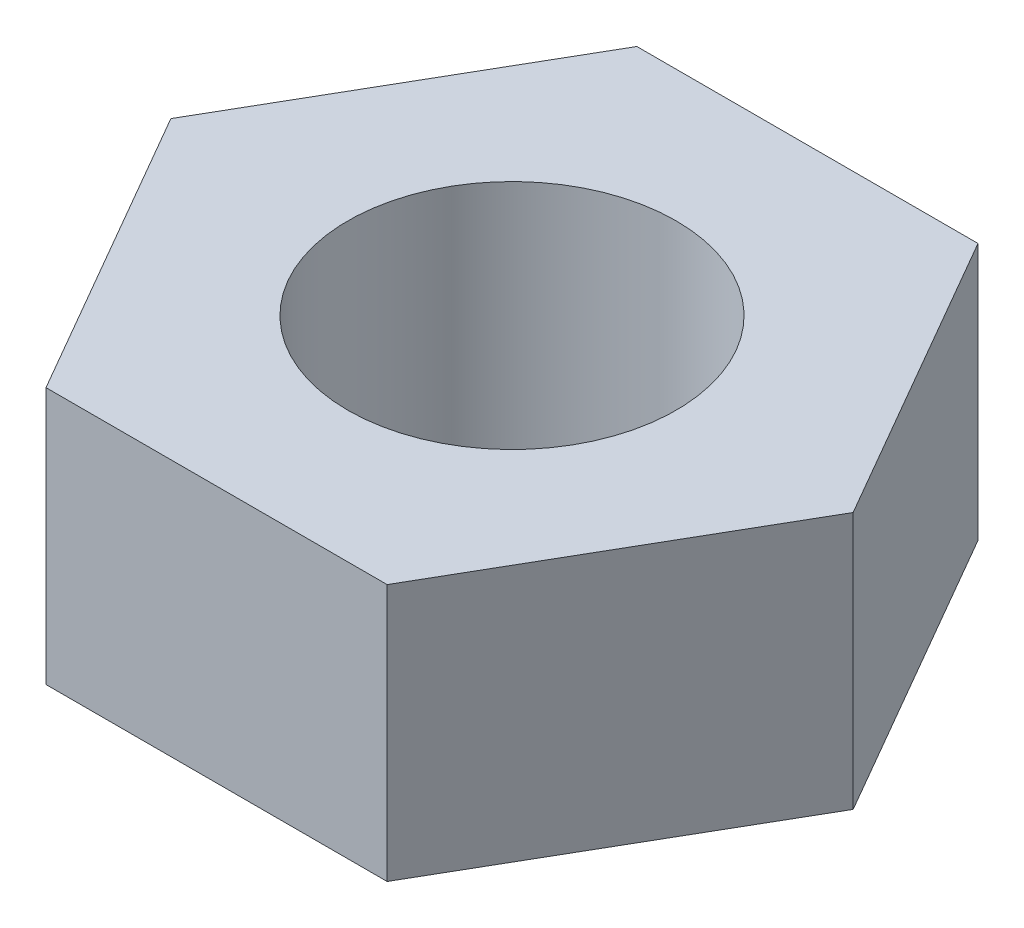
ISO-10303-21;
HEADER;
FILE_DESCRIPTION(('STEP AP214'),'2;1');
FILE_NAME('part.step','',(''),(''),'','','');
FILE_SCHEMA(('AUTOMOTIVE_DESIGN { 1 0 10303 214 1 1 1 1 }'));
ENDSEC;
DATA;
#1=APPLICATION_CONTEXT('core data for automotive mechanical design processes');
#2=APPLICATION_PROTOCOL_DEFINITION('international standard','automotive_design',2000,#1);
#3=PRODUCT_CONTEXT('',#1,'mechanical');
#4=PRODUCT('Part','Part','',(#3));
#5=PRODUCT_RELATED_PRODUCT_CATEGORY('part','',(#4));
#6=PRODUCT_DEFINITION_FORMATION('','',#4);
#7=PRODUCT_DEFINITION_CONTEXT('part definition',#1,'design');
#8=PRODUCT_DEFINITION('design','',#6,#7);
#9=PRODUCT_DEFINITION_SHAPE('','',#8);
#10=(LENGTH_UNIT() NAMED_UNIT(*) SI_UNIT(.MILLI.,.METRE.));
#11=(NAMED_UNIT(*) PLANE_ANGLE_UNIT() SI_UNIT($,.RADIAN.));
#12=(NAMED_UNIT(*) SI_UNIT($,.STERADIAN.) SOLID_ANGLE_UNIT());
#13=UNCERTAINTY_MEASURE_WITH_UNIT(LENGTH_MEASURE(1.E-05),#10,'distance_accuracy_value','');
#14=(GEOMETRIC_REPRESENTATION_CONTEXT(3) GLOBAL_UNCERTAINTY_ASSIGNED_CONTEXT((#13)) GLOBAL_UNIT_ASSIGNED_CONTEXT((#10,
#11,#12)) REPRESENTATION_CONTEXT('',''));
#15=CARTESIAN_POINT('',(0.,0.,0.));
#16=DIRECTION('',(0.,0.,1.));
#17=DIRECTION('',(1.,0.,0.));
#18=AXIS2_PLACEMENT_3D('',#15,#16,#17);
#19=CARTESIAN_POINT('',(0.,2.35,0.));
#20=DIRECTION('',(0.,1.,0.));
#21=DIRECTION('',(0.,0.,1.));
#22=AXIS2_PLACEMENT_3D('',#19,#20,#21);
#23=PLANE('',#22);
#24=DIRECTION('',(1.,0.,0.));
#25=VECTOR('',#24,1.);
#26=CARTESIAN_POINT('',(-1.55884572681199,2.35,2.7));
#27=LINE('',#26,#25);
#28=CARTESIAN_POINT('',(-1.55884572681199,2.35,2.7));
#29=VERTEX_POINT('',#28);
#30=CARTESIAN_POINT('',(1.55884572681199,2.35,2.7));
#31=VERTEX_POINT('',#30);
#32=EDGE_CURVE('E130',#29,#31,#27,.T.);
#33=ORIENTED_EDGE('',*,*,#32,.T.);
#34=DIRECTION('',(0.5,0.,-0.866025403784439));
#35=VECTOR('',#34,1.);
#36=CARTESIAN_POINT('',(1.55884572681199,2.35,2.7));
#37=LINE('',#36,#35);
#38=CARTESIAN_POINT('',(3.11769145362398,2.35,0.));
#39=VERTEX_POINT('',#38);
#40=EDGE_CURVE('E88',#31,#39,#37,.T.);
#41=ORIENTED_EDGE('',*,*,#40,.T.);
#42=DIRECTION('',(-0.5,0.,-0.866025403784438));
#43=VECTOR('',#42,1.);
#44=CARTESIAN_POINT('',(3.11769145362398,2.35,0.));
#45=LINE('',#44,#43);
#46=CARTESIAN_POINT('',(1.55884572681199,2.35,-2.7));
#47=VERTEX_POINT('',#46);
#48=EDGE_CURVE('E101',#39,#47,#45,.T.);
#49=ORIENTED_EDGE('',*,*,#48,.T.);
#50=DIRECTION('',(-1.,0.,0.));
#51=VECTOR('',#50,1.);
#52=CARTESIAN_POINT('',(1.55884572681199,2.35,-2.7));
#53=LINE('',#52,#51);
#54=CARTESIAN_POINT('',(-1.55884572681199,2.35,-2.7));
#55=VERTEX_POINT('',#54);
#56=EDGE_CURVE('E95',#47,#55,#53,.T.);
#57=ORIENTED_EDGE('',*,*,#56,.T.);
#58=DIRECTION('',(-0.5,0.,0.866025403784439));
#59=VECTOR('',#58,1.);
#60=CARTESIAN_POINT('',(-1.55884572681199,2.35,-2.7));
#61=LINE('',#60,#59);
#62=CARTESIAN_POINT('',(-3.11769145362398,2.35,0.));
#63=VERTEX_POINT('',#62);
#64=EDGE_CURVE('E99',#55,#63,#61,.T.);
#65=ORIENTED_EDGE('',*,*,#64,.T.);
#66=DIRECTION('',(0.5,0.,0.866025403784438));
#67=VECTOR('',#66,1.);
#68=CARTESIAN_POINT('',(-3.11769145362398,2.35,0.));
#69=LINE('',#68,#67);
#70=EDGE_CURVE('E51',#63,#29,#69,.T.);
#71=ORIENTED_EDGE('',*,*,#70,.T.);
#72=EDGE_LOOP('',(#33,#41,#49,#57,#65,#71));
#73=FACE_BOUND('',#72,.T.);
#74=CARTESIAN_POINT('',(0.,2.35,0.));
#75=DIRECTION('',(0.,1.,0.));
#76=DIRECTION('',(0.,0.,1.));
#77=AXIS2_PLACEMENT_3D('',#74,#75,#76);
#78=CIRCLE('',#77,1.5);
#79=CARTESIAN_POINT('',(0.,2.35,1.5));
#80=VERTEX_POINT('',#79);
#81=EDGE_CURVE('E123',#80,#80,#78,.T.);
#82=ORIENTED_EDGE('',*,*,#81,.F.);
#83=EDGE_LOOP('',(#82));
#84=FACE_BOUND('',#83,.T.);
#85=ADVANCED_FACE('F34',(#73,#84),#23,.T.);
#86=CARTESIAN_POINT('',(0.,0.,0.));
#87=DIRECTION('',(0.,1.,0.));
#88=DIRECTION('',(0.,0.,1.));
#89=AXIS2_PLACEMENT_3D('',#86,#87,#88);
#90=PLANE('',#89);
#91=DIRECTION('',(1.,0.,0.));
#92=VECTOR('',#91,1.);
#93=CARTESIAN_POINT('',(-1.55884572681199,0.,2.7));
#94=LINE('',#93,#92);
#95=CARTESIAN_POINT('',(-1.55884572681199,0.,2.7));
#96=VERTEX_POINT('',#95);
#97=CARTESIAN_POINT('',(1.55884572681199,0.,2.7));
#98=VERTEX_POINT('',#97);
#99=EDGE_CURVE('E119',#96,#98,#94,.T.);
#100=ORIENTED_EDGE('',*,*,#99,.F.);
#101=DIRECTION('',(0.5,0.,0.866025403784438));
#102=VECTOR('',#101,1.);
#103=CARTESIAN_POINT('',(-3.11769145362398,0.,0.));
#104=LINE('',#103,#102);
#105=CARTESIAN_POINT('',(-3.11769145362398,0.,0.));
#106=VERTEX_POINT('',#105);
#107=EDGE_CURVE('E80',#106,#96,#104,.T.);
#108=ORIENTED_EDGE('',*,*,#107,.F.);
#109=DIRECTION('',(-0.5,0.,0.866025403784439));
#110=VECTOR('',#109,1.);
#111=CARTESIAN_POINT('',(-1.55884572681199,0.,-2.7));
#112=LINE('',#111,#110);
#113=CARTESIAN_POINT('',(-1.55884572681199,0.,-2.7));
#114=VERTEX_POINT('',#113);
#115=EDGE_CURVE('E74',#114,#106,#112,.T.);
#116=ORIENTED_EDGE('',*,*,#115,.F.);
#117=DIRECTION('',(-1.,0.,0.));
#118=VECTOR('',#117,1.);
#119=CARTESIAN_POINT('',(1.55884572681199,0.,-2.7));
#120=LINE('',#119,#118);
#121=CARTESIAN_POINT('',(1.55884572681199,0.,-2.7));
#122=VERTEX_POINT('',#121);
#123=EDGE_CURVE('E109',#122,#114,#120,.T.);
#124=ORIENTED_EDGE('',*,*,#123,.F.);
#125=DIRECTION('',(-0.5,0.,-0.866025403784438));
#126=VECTOR('',#125,1.);
#127=CARTESIAN_POINT('',(3.11769145362398,0.,0.));
#128=LINE('',#127,#126);
#129=CARTESIAN_POINT('',(3.11769145362398,0.,0.));
#130=VERTEX_POINT('',#129);
#131=EDGE_CURVE('E125',#130,#122,#128,.T.);
#132=ORIENTED_EDGE('',*,*,#131,.F.);
#133=DIRECTION('',(0.5,0.,-0.866025403784439));
#134=VECTOR('',#133,1.);
#135=CARTESIAN_POINT('',(1.55884572681199,0.,2.7));
#136=LINE('',#135,#134);
#137=EDGE_CURVE('E122',#98,#130,#136,.T.);
#138=ORIENTED_EDGE('',*,*,#137,.F.);
#139=EDGE_LOOP('',(#100,#108,#116,#124,#132,#138));
#140=FACE_BOUND('',#139,.T.);
#141=CARTESIAN_POINT('',(0.,0.,0.));
#142=DIRECTION('',(0.,1.,0.));
#143=DIRECTION('',(0.,0.,1.));
#144=AXIS2_PLACEMENT_3D('',#141,#142,#143);
#145=CIRCLE('',#144,1.5);
#146=CARTESIAN_POINT('',(0.,0.,1.5));
#147=VERTEX_POINT('',#146);
#148=EDGE_CURVE('E223',#147,#147,#145,.T.);
#149=ORIENTED_EDGE('',*,*,#148,.T.);
#150=EDGE_LOOP('',(#149));
#151=FACE_BOUND('',#150,.T.);
#152=ADVANCED_FACE('F139',(#140,#151),#90,.F.);
#153=CARTESIAN_POINT('',(-1.55884572681199,2.35,2.7));
#154=DIRECTION('',(0.,0.,-1.));
#155=DIRECTION('',(-1.,0.,0.));
#156=AXIS2_PLACEMENT_3D('',#153,#154,#155);
#157=PLANE('',#156);
#158=ORIENTED_EDGE('',*,*,#99,.T.);
#159=DIRECTION('',(0.,-1.,0.));
#160=VECTOR('',#159,1.);
#161=CARTESIAN_POINT('',(1.55884572681199,2.35,2.7));
#162=LINE('',#161,#160);
#163=EDGE_CURVE('E11',#31,#98,#162,.T.);
#164=ORIENTED_EDGE('',*,*,#163,.F.);
#165=ORIENTED_EDGE('',*,*,#32,.F.);
#166=DIRECTION('',(0.,-1.,0.));
#167=VECTOR('',#166,1.);
#168=CARTESIAN_POINT('',(-1.55884572681199,2.35,2.7));
#169=LINE('',#168,#167);
#170=EDGE_CURVE('E115',#29,#96,#169,.T.);
#171=ORIENTED_EDGE('',*,*,#170,.T.);
#172=EDGE_LOOP('',(#158,#164,#165,#171));
#173=FACE_BOUND('',#172,.T.);
#174=ADVANCED_FACE('F36',(#173),#157,.F.);
#175=CARTESIAN_POINT('',(1.55884572681199,2.35,2.7));
#176=DIRECTION('',(-0.866025403784439,0.,-0.5));
#177=DIRECTION('',(-0.5,0.,0.866025403784439));
#178=AXIS2_PLACEMENT_3D('',#175,#176,#177);
#179=PLANE('',#178);
#180=ORIENTED_EDGE('',*,*,#137,.T.);
#181=DIRECTION('',(0.,-1.,0.));
#182=VECTOR('',#181,1.);
#183=CARTESIAN_POINT('',(3.11769145362398,2.35,0.));
#184=LINE('',#183,#182);
#185=EDGE_CURVE('E43',#39,#130,#184,.T.);
#186=ORIENTED_EDGE('',*,*,#185,.F.);
#187=ORIENTED_EDGE('',*,*,#40,.F.);
#188=ORIENTED_EDGE('',*,*,#163,.T.);
#189=EDGE_LOOP('',(#180,#186,#187,#188));
#190=FACE_BOUND('',#189,.T.);
#191=ADVANCED_FACE('F164',(#190),#179,.F.);
#192=CARTESIAN_POINT('',(3.11769145362398,2.35,0.));
#193=DIRECTION('',(-0.866025403784438,0.,0.5));
#194=DIRECTION('',(0.5,0.,0.866025403784438));
#195=AXIS2_PLACEMENT_3D('',#192,#193,#194);
#196=PLANE('',#195);
#197=ORIENTED_EDGE('',*,*,#131,.T.);
#198=DIRECTION('',(0.,-1.,0.));
#199=VECTOR('',#198,1.);
#200=CARTESIAN_POINT('',(1.55884572681199,2.35,-2.7));
#201=LINE('',#200,#199);
#202=EDGE_CURVE('E110',#47,#122,#201,.T.);
#203=ORIENTED_EDGE('',*,*,#202,.F.);
#204=ORIENTED_EDGE('',*,*,#48,.F.);
#205=ORIENTED_EDGE('',*,*,#185,.T.);
#206=EDGE_LOOP('',(#197,#203,#204,#205));
#207=FACE_BOUND('',#206,.T.);
#208=ADVANCED_FACE('F136',(#207),#196,.F.);
#209=CARTESIAN_POINT('',(1.55884572681199,2.35,-2.7));
#210=DIRECTION('',(0.,0.,1.));
#211=DIRECTION('',(1.,0.,0.));
#212=AXIS2_PLACEMENT_3D('',#209,#210,#211);
#213=PLANE('',#212);
#214=ORIENTED_EDGE('',*,*,#123,.T.);
#215=DIRECTION('',(0.,-1.,0.));
#216=VECTOR('',#215,1.);
#217=CARTESIAN_POINT('',(-1.55884572681199,2.35,-2.7));
#218=LINE('',#217,#216);
#219=EDGE_CURVE('E106',#55,#114,#218,.T.);
#220=ORIENTED_EDGE('',*,*,#219,.F.);
#221=ORIENTED_EDGE('',*,*,#56,.F.);
#222=ORIENTED_EDGE('',*,*,#202,.T.);
#223=EDGE_LOOP('',(#214,#220,#221,#222));
#224=FACE_BOUND('',#223,.T.);
#225=ADVANCED_FACE('F107',(#224),#213,.F.);
#226=CARTESIAN_POINT('',(-1.55884572681199,2.35,-2.7));
#227=DIRECTION('',(0.866025403784439,0.,0.5));
#228=DIRECTION('',(0.5,0.,-0.866025403784439));
#229=AXIS2_PLACEMENT_3D('',#226,#227,#228);
#230=PLANE('',#229);
#231=ORIENTED_EDGE('',*,*,#115,.T.);
#232=DIRECTION('',(0.,-1.,0.));
#233=VECTOR('',#232,1.);
#234=CARTESIAN_POINT('',(-3.11769145362398,2.35,0.));
#235=LINE('',#234,#233);
#236=EDGE_CURVE('E111',#63,#106,#235,.T.);
#237=ORIENTED_EDGE('',*,*,#236,.F.);
#238=ORIENTED_EDGE('',*,*,#64,.F.);
#239=ORIENTED_EDGE('',*,*,#219,.T.);
#240=EDGE_LOOP('',(#231,#237,#238,#239));
#241=FACE_BOUND('',#240,.T.);
#242=ADVANCED_FACE('F113',(#241),#230,.F.);
#243=CARTESIAN_POINT('',(-3.11769145362398,2.35,0.));
#244=DIRECTION('',(0.866025403784439,0.,-0.5));
#245=DIRECTION('',(-0.5,0.,-0.866025403784439));
#246=AXIS2_PLACEMENT_3D('',#243,#244,#245);
#247=PLANE('',#246);
#248=ORIENTED_EDGE('',*,*,#107,.T.);
#249=ORIENTED_EDGE('',*,*,#170,.F.);
#250=ORIENTED_EDGE('',*,*,#70,.F.);
#251=ORIENTED_EDGE('',*,*,#236,.T.);
#252=EDGE_LOOP('',(#248,#249,#250,#251));
#253=FACE_BOUND('',#252,.T.);
#254=ADVANCED_FACE('F144',(#253),#247,.F.);
#255=CARTESIAN_POINT('',(0.,2.35,0.));
#256=DIRECTION('',(0.,-1.,0.));
#257=DIRECTION('',(0.,0.,-1.));
#258=AXIS2_PLACEMENT_3D('',#255,#256,#257);
#259=CYLINDRICAL_SURFACE('',#258,1.5);
#260=ORIENTED_EDGE('',*,*,#81,.T.);
#261=EDGE_LOOP('',(#260));
#262=FACE_BOUND('',#261,.T.);
#263=ORIENTED_EDGE('',*,*,#148,.F.);
#264=EDGE_LOOP('',(#263));
#265=FACE_BOUND('',#264,.T.);
#266=ADVANCED_FACE('F146',(#262,#265),#259,.F.);
#267=CLOSED_SHELL('',(#85,#152,#174,#191,#208,#225,#242,#254,#266));
#268=MANIFOLD_SOLID_BREP('B2',#267);
#269=ADVANCED_BREP_SHAPE_REPRESENTATION('',(#18,#268),#14);
#270=SHAPE_DEFINITION_REPRESENTATION(#9,#269);
ENDSEC;
END-ISO-10303-21;
